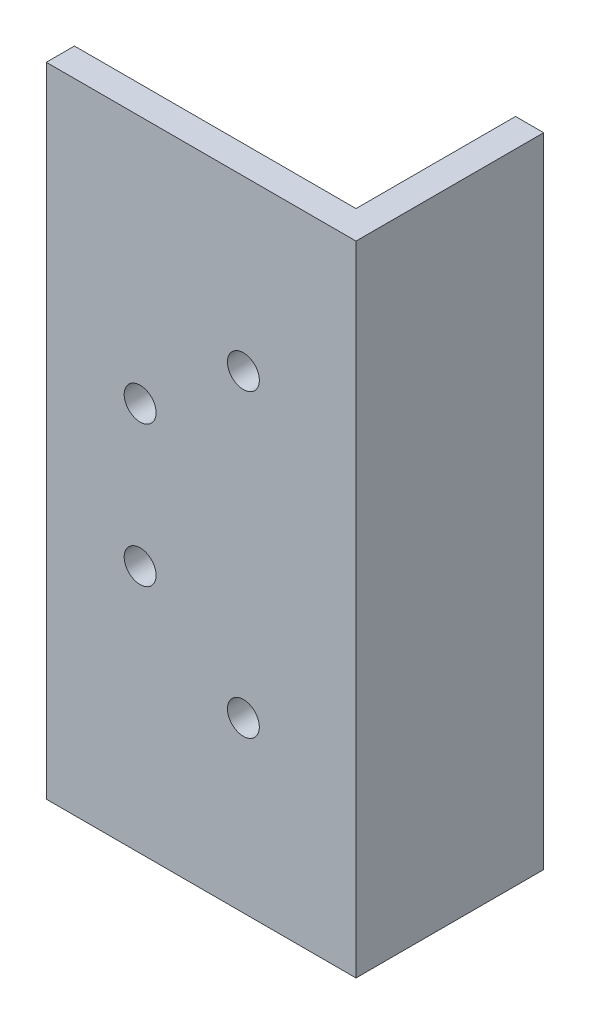
ISO-10303-21;
HEADER;
FILE_DESCRIPTION(('STEP AP214'),'2;1');
FILE_NAME('part.step','',(''),(''),'','','');
FILE_SCHEMA(('AUTOMOTIVE_DESIGN { 1 0 10303 214 1 1 1 1 }'));
ENDSEC;
DATA;
#1=APPLICATION_CONTEXT('core data for automotive mechanical design processes');
#2=APPLICATION_PROTOCOL_DEFINITION('international standard','automotive_design',2000,#1);
#3=PRODUCT_CONTEXT('',#1,'mechanical');
#4=PRODUCT('Part','Part','',(#3));
#5=PRODUCT_RELATED_PRODUCT_CATEGORY('part','',(#4));
#6=PRODUCT_DEFINITION_FORMATION('','',#4);
#7=PRODUCT_DEFINITION_CONTEXT('part definition',#1,'design');
#8=PRODUCT_DEFINITION('design','',#6,#7);
#9=PRODUCT_DEFINITION_SHAPE('','',#8);
#10=(LENGTH_UNIT() NAMED_UNIT(*) SI_UNIT(.MILLI.,.METRE.));
#11=(NAMED_UNIT(*) PLANE_ANGLE_UNIT() SI_UNIT($,.RADIAN.));
#12=(NAMED_UNIT(*) SI_UNIT($,.STERADIAN.) SOLID_ANGLE_UNIT());
#13=UNCERTAINTY_MEASURE_WITH_UNIT(LENGTH_MEASURE(1.E-05),#10,'distance_accuracy_value','');
#14=(GEOMETRIC_REPRESENTATION_CONTEXT(3) GLOBAL_UNCERTAINTY_ASSIGNED_CONTEXT((#13)) GLOBAL_UNIT_ASSIGNED_CONTEXT((#10,
#11,#12)) REPRESENTATION_CONTEXT('',''));
#15=CARTESIAN_POINT('',(0.,0.,0.));
#16=DIRECTION('',(0.,0.,1.));
#17=DIRECTION('',(1.,0.,0.));
#18=AXIS2_PLACEMENT_3D('',#15,#16,#17);
#19=CARTESIAN_POINT('',(0.,68.,0.));
#20=DIRECTION('',(0.,0.,-1.));
#21=DIRECTION('',(-1.,0.,0.));
#22=AXIS2_PLACEMENT_3D('',#19,#20,#21);
#23=PLANE('',#22);
#24=CARTESIAN_POINT('',(10.,41.5,0.));
#25=DIRECTION('',(0.,0.,1.));
#26=DIRECTION('',(1.,0.,0.));
#27=AXIS2_PLACEMENT_3D('',#24,#25,#26);
#28=CIRCLE('',#27,1.7);
#29=CARTESIAN_POINT('',(11.7,41.5,0.));
#30=VERTEX_POINT('',#29);
#31=EDGE_CURVE('E164',#30,#30,#28,.T.);
#32=ORIENTED_EDGE('',*,*,#31,.F.);
#33=EDGE_LOOP('',(#32));
#34=FACE_BOUND('',#33,.T.);
#35=CARTESIAN_POINT('',(10.,26.5,0.));
#36=DIRECTION('',(0.,0.,1.));
#37=DIRECTION('',(1.,0.,0.));
#38=AXIS2_PLACEMENT_3D('',#35,#36,#37);
#39=CIRCLE('',#38,1.7);
#40=CARTESIAN_POINT('',(11.7,26.5,0.));
#41=VERTEX_POINT('',#40);
#42=EDGE_CURVE('E168',#41,#41,#39,.T.);
#43=ORIENTED_EDGE('',*,*,#42,.F.);
#44=EDGE_LOOP('',(#43));
#45=FACE_BOUND('',#44,.T.);
#46=CARTESIAN_POINT('',(21.,50.,0.));
#47=DIRECTION('',(0.,0.,1.));
#48=DIRECTION('',(1.,0.,0.));
#49=AXIS2_PLACEMENT_3D('',#46,#47,#48);
#50=CIRCLE('',#49,1.7);
#51=CARTESIAN_POINT('',(22.7,50.,0.));
#52=VERTEX_POINT('',#51);
#53=EDGE_CURVE('E172',#52,#52,#50,.T.);
#54=ORIENTED_EDGE('',*,*,#53,.F.);
#55=EDGE_LOOP('',(#54));
#56=FACE_BOUND('',#55,.T.);
#57=CARTESIAN_POINT('',(21.,18.,0.));
#58=DIRECTION('',(0.,0.,1.));
#59=DIRECTION('',(1.,0.,0.));
#60=AXIS2_PLACEMENT_3D('',#57,#58,#59);
#61=CIRCLE('',#60,1.7);
#62=CARTESIAN_POINT('',(22.7,18.,0.));
#63=VERTEX_POINT('',#62);
#64=EDGE_CURVE('E125',#63,#63,#61,.T.);
#65=ORIENTED_EDGE('',*,*,#64,.F.);
#66=EDGE_LOOP('',(#65));
#67=FACE_BOUND('',#66,.T.);
#68=DIRECTION('',(1.,0.,0.));
#69=VECTOR('',#68,1.);
#70=CARTESIAN_POINT('',(0.,0.,0.));
#71=LINE('',#70,#69);
#72=CARTESIAN_POINT('',(0.,0.,0.));
#73=VERTEX_POINT('',#72);
#74=CARTESIAN_POINT('',(33.,0.,0.));
#75=VERTEX_POINT('',#74);
#76=EDGE_CURVE('E122',#73,#75,#71,.T.);
#77=ORIENTED_EDGE('',*,*,#76,.T.);
#78=DIRECTION('',(0.,-1.,0.));
#79=VECTOR('',#78,1.);
#80=CARTESIAN_POINT('',(33.,68.,0.));
#81=LINE('',#80,#79);
#82=CARTESIAN_POINT('',(33.,68.,0.));
#83=VERTEX_POINT('',#82);
#84=EDGE_CURVE('E11',#83,#75,#81,.T.);
#85=ORIENTED_EDGE('',*,*,#84,.F.);
#86=DIRECTION('',(1.,0.,0.));
#87=VECTOR('',#86,1.);
#88=CARTESIAN_POINT('',(0.,68.,0.));
#89=LINE('',#88,#87);
#90=CARTESIAN_POINT('',(0.,68.,0.));
#91=VERTEX_POINT('',#90);
#92=EDGE_CURVE('E135',#91,#83,#89,.T.);
#93=ORIENTED_EDGE('',*,*,#92,.F.);
#94=DIRECTION('',(0.,-1.,0.));
#95=VECTOR('',#94,1.);
#96=CARTESIAN_POINT('',(0.,68.,0.));
#97=LINE('',#96,#95);
#98=EDGE_CURVE('E53',#91,#73,#97,.T.);
#99=ORIENTED_EDGE('',*,*,#98,.T.);
#100=EDGE_LOOP('',(#77,#85,#93,#99));
#101=FACE_BOUND('',#100,.T.);
#102=ADVANCED_FACE('F37',(#34,#45,#56,#67,#101),#23,.F.);
#103=CARTESIAN_POINT('',(33.,68.,0.));
#104=DIRECTION('',(-1.,0.,0.));
#105=DIRECTION('',(0.,0.,1.));
#106=AXIS2_PLACEMENT_3D('',#103,#104,#105);
#107=PLANE('',#106);
#108=DIRECTION('',(0.,0.,-1.));
#109=VECTOR('',#108,1.);
#110=CARTESIAN_POINT('',(33.,0.,0.));
#111=LINE('',#110,#109);
#112=CARTESIAN_POINT('',(33.,0.,-20.));
#113=VERTEX_POINT('',#112);
#114=EDGE_CURVE('E124',#75,#113,#111,.T.);
#115=ORIENTED_EDGE('',*,*,#114,.T.);
#116=DIRECTION('',(0.,-1.,0.));
#117=VECTOR('',#116,1.);
#118=CARTESIAN_POINT('',(33.,68.,-20.));
#119=LINE('',#118,#117);
#120=CARTESIAN_POINT('',(33.,68.,-20.));
#121=VERTEX_POINT('',#120);
#122=EDGE_CURVE('E45',#121,#113,#119,.T.);
#123=ORIENTED_EDGE('',*,*,#122,.F.);
#124=DIRECTION('',(0.,0.,-1.));
#125=VECTOR('',#124,1.);
#126=CARTESIAN_POINT('',(33.,68.,0.));
#127=LINE('',#126,#125);
#128=EDGE_CURVE('E85',#83,#121,#127,.T.);
#129=ORIENTED_EDGE('',*,*,#128,.F.);
#130=ORIENTED_EDGE('',*,*,#84,.T.);
#131=EDGE_LOOP('',(#115,#123,#129,#130));
#132=FACE_BOUND('',#131,.T.);
#133=ADVANCED_FACE('F156',(#132),#107,.F.);
#134=CARTESIAN_POINT('',(0.,68.,-20.));
#135=DIRECTION('',(0.,0.,1.));
#136=DIRECTION('',(1.,0.,0.));
#137=AXIS2_PLACEMENT_3D('',#134,#135,#136);
#138=PLANE('',#137);
#139=DIRECTION('',(-1.,0.,0.));
#140=VECTOR('',#139,1.);
#141=CARTESIAN_POINT('',(0.,0.,-20.));
#142=LINE('',#141,#140);
#143=CARTESIAN_POINT('',(30.,0.,-20.));
#144=VERTEX_POINT('',#143);
#145=EDGE_CURVE('E127',#113,#144,#142,.T.);
#146=ORIENTED_EDGE('',*,*,#145,.T.);
#147=DIRECTION('',(0.,-1.,0.));
#148=VECTOR('',#147,1.);
#149=CARTESIAN_POINT('',(30.,68.,-20.));
#150=LINE('',#149,#148);
#151=CARTESIAN_POINT('',(30.,68.,-20.));
#152=VERTEX_POINT('',#151);
#153=EDGE_CURVE('E114',#152,#144,#150,.T.);
#154=ORIENTED_EDGE('',*,*,#153,.F.);
#155=DIRECTION('',(-1.,0.,0.));
#156=VECTOR('',#155,1.);
#157=CARTESIAN_POINT('',(0.,68.,-20.));
#158=LINE('',#157,#156);
#159=EDGE_CURVE('E102',#121,#152,#158,.T.);
#160=ORIENTED_EDGE('',*,*,#159,.F.);
#161=ORIENTED_EDGE('',*,*,#122,.T.);
#162=EDGE_LOOP('',(#146,#154,#160,#161));
#163=FACE_BOUND('',#162,.T.);
#164=ADVANCED_FACE('F141',(#163),#138,.F.);
#165=CARTESIAN_POINT('',(30.,68.,0.));
#166=DIRECTION('',(1.,0.,0.));
#167=DIRECTION('',(0.,0.,-1.));
#168=AXIS2_PLACEMENT_3D('',#165,#166,#167);
#169=PLANE('',#168);
#170=DIRECTION('',(0.,0.,1.));
#171=VECTOR('',#170,1.);
#172=CARTESIAN_POINT('',(30.,0.,0.));
#173=LINE('',#172,#171);
#174=CARTESIAN_POINT('',(30.,0.,-3.));
#175=VERTEX_POINT('',#174);
#176=EDGE_CURVE('E111',#144,#175,#173,.T.);
#177=ORIENTED_EDGE('',*,*,#176,.T.);
#178=DIRECTION('',(0.,-1.,0.));
#179=VECTOR('',#178,1.);
#180=CARTESIAN_POINT('',(30.,68.,-3.));
#181=LINE('',#180,#179);
#182=CARTESIAN_POINT('',(30.,68.,-3.));
#183=VERTEX_POINT('',#182);
#184=EDGE_CURVE('E108',#183,#175,#181,.T.);
#185=ORIENTED_EDGE('',*,*,#184,.F.);
#186=DIRECTION('',(0.,0.,1.));
#187=VECTOR('',#186,1.);
#188=CARTESIAN_POINT('',(30.,68.,0.));
#189=LINE('',#188,#187);
#190=EDGE_CURVE('E95',#152,#183,#189,.T.);
#191=ORIENTED_EDGE('',*,*,#190,.F.);
#192=ORIENTED_EDGE('',*,*,#153,.T.);
#193=EDGE_LOOP('',(#177,#185,#191,#192));
#194=FACE_BOUND('',#193,.T.);
#195=ADVANCED_FACE('F109',(#194),#169,.F.);
#196=CARTESIAN_POINT('',(0.,68.,-3.));
#197=DIRECTION('',(0.,0.,-1.));
#198=DIRECTION('',(-1.,0.,0.));
#199=AXIS2_PLACEMENT_3D('',#196,#197,#198);
#200=PLANE('',#199);
#201=CARTESIAN_POINT('',(10.,41.5,-3.));
#202=DIRECTION('',(0.,0.,-1.));
#203=DIRECTION('',(-1.,0.,0.));
#204=AXIS2_PLACEMENT_3D('',#201,#202,#203);
#205=CIRCLE('',#204,1.7);
#206=CARTESIAN_POINT('',(8.3,41.5,-3.));
#207=VERTEX_POINT('',#206);
#208=EDGE_CURVE('E191',#207,#207,#205,.F.);
#209=ORIENTED_EDGE('',*,*,#208,.T.);
#210=EDGE_LOOP('',(#209));
#211=FACE_BOUND('',#210,.T.);
#212=CARTESIAN_POINT('',(10.,26.5,-3.));
#213=DIRECTION('',(0.,0.,-1.));
#214=DIRECTION('',(-1.,0.,0.));
#215=AXIS2_PLACEMENT_3D('',#212,#213,#214);
#216=CIRCLE('',#215,1.7);
#217=CARTESIAN_POINT('',(8.3,26.5,-3.));
#218=VERTEX_POINT('',#217);
#219=EDGE_CURVE('E187',#218,#218,#216,.F.);
#220=ORIENTED_EDGE('',*,*,#219,.T.);
#221=EDGE_LOOP('',(#220));
#222=FACE_BOUND('',#221,.T.);
#223=CARTESIAN_POINT('',(21.,50.,-3.));
#224=DIRECTION('',(0.,0.,-1.));
#225=DIRECTION('',(-1.,0.,0.));
#226=AXIS2_PLACEMENT_3D('',#223,#224,#225);
#227=CIRCLE('',#226,1.7);
#228=CARTESIAN_POINT('',(19.3,50.,-3.));
#229=VERTEX_POINT('',#228);
#230=EDGE_CURVE('E183',#229,#229,#227,.F.);
#231=ORIENTED_EDGE('',*,*,#230,.T.);
#232=EDGE_LOOP('',(#231));
#233=FACE_BOUND('',#232,.T.);
#234=CARTESIAN_POINT('',(21.,18.,-3.));
#235=DIRECTION('',(0.,0.,-1.));
#236=DIRECTION('',(-1.,0.,0.));
#237=AXIS2_PLACEMENT_3D('',#234,#235,#236);
#238=CIRCLE('',#237,1.7);
#239=CARTESIAN_POINT('',(19.3,18.,-3.));
#240=VERTEX_POINT('',#239);
#241=EDGE_CURVE('E179',#240,#240,#238,.F.);
#242=ORIENTED_EDGE('',*,*,#241,.T.);
#243=EDGE_LOOP('',(#242));
#244=FACE_BOUND('',#243,.T.);
#245=DIRECTION('',(1.,0.,0.));
#246=VECTOR('',#245,1.);
#247=CARTESIAN_POINT('',(0.,0.,-3.));
#248=LINE('',#247,#246);
#249=CARTESIAN_POINT('',(0.,0.,-3.));
#250=VERTEX_POINT('',#249);
#251=EDGE_CURVE('E130',#250,#175,#248,.T.);
#252=ORIENTED_EDGE('',*,*,#251,.F.);
#253=DIRECTION('',(0.,-1.,0.));
#254=VECTOR('',#253,1.);
#255=CARTESIAN_POINT('',(0.,68.,-3.));
#256=LINE('',#255,#254);
#257=CARTESIAN_POINT('',(0.,68.,-3.));
#258=VERTEX_POINT('',#257);
#259=EDGE_CURVE('E73',#258,#250,#256,.T.);
#260=ORIENTED_EDGE('',*,*,#259,.F.);
#261=DIRECTION('',(1.,0.,0.));
#262=VECTOR('',#261,1.);
#263=CARTESIAN_POINT('',(0.,68.,-3.));
#264=LINE('',#263,#262);
#265=EDGE_CURVE('E100',#258,#183,#264,.T.);
#266=ORIENTED_EDGE('',*,*,#265,.T.);
#267=ORIENTED_EDGE('',*,*,#184,.T.);
#268=EDGE_LOOP('',(#252,#260,#266,#267));
#269=FACE_BOUND('',#268,.T.);
#270=ADVANCED_FACE('F116',(#211,#222,#233,#244,#269),#200,.T.);
#271=CARTESIAN_POINT('',(0.,68.,0.));
#272=DIRECTION('',(-1.,0.,0.));
#273=DIRECTION('',(0.,0.,1.));
#274=AXIS2_PLACEMENT_3D('',#271,#272,#273);
#275=PLANE('',#274);
#276=DIRECTION('',(0.,0.,-1.));
#277=VECTOR('',#276,1.);
#278=CARTESIAN_POINT('',(0.,0.,0.));
#279=LINE('',#278,#277);
#280=EDGE_CURVE('E132',#73,#250,#279,.T.);
#281=ORIENTED_EDGE('',*,*,#280,.F.);
#282=ORIENTED_EDGE('',*,*,#98,.F.);
#283=DIRECTION('',(0.,0.,-1.));
#284=VECTOR('',#283,1.);
#285=CARTESIAN_POINT('',(0.,68.,0.));
#286=LINE('',#285,#284);
#287=EDGE_CURVE('E117',#91,#258,#286,.T.);
#288=ORIENTED_EDGE('',*,*,#287,.T.);
#289=ORIENTED_EDGE('',*,*,#259,.T.);
#290=EDGE_LOOP('',(#281,#282,#288,#289));
#291=FACE_BOUND('',#290,.T.);
#292=ADVANCED_FACE('F144',(#291),#275,.T.);
#293=CARTESIAN_POINT('',(0.,68.,0.));
#294=DIRECTION('',(0.,1.,0.));
#295=DIRECTION('',(0.,0.,1.));
#296=AXIS2_PLACEMENT_3D('',#293,#294,#295);
#297=PLANE('',#296);
#298=ORIENTED_EDGE('',*,*,#92,.T.);
#299=ORIENTED_EDGE('',*,*,#128,.T.);
#300=ORIENTED_EDGE('',*,*,#159,.T.);
#301=ORIENTED_EDGE('',*,*,#190,.T.);
#302=ORIENTED_EDGE('',*,*,#265,.F.);
#303=ORIENTED_EDGE('',*,*,#287,.F.);
#304=EDGE_LOOP('',(#298,#299,#300,#301,#302,#303));
#305=FACE_BOUND('',#304,.T.);
#306=ADVANCED_FACE('F97',(#305),#297,.T.);
#307=CARTESIAN_POINT('',(0.,0.,0.));
#308=DIRECTION('',(0.,1.,0.));
#309=DIRECTION('',(0.,0.,1.));
#310=AXIS2_PLACEMENT_3D('',#307,#308,#309);
#311=PLANE('',#310);
#312=ORIENTED_EDGE('',*,*,#76,.F.);
#313=ORIENTED_EDGE('',*,*,#280,.T.);
#314=ORIENTED_EDGE('',*,*,#251,.T.);
#315=ORIENTED_EDGE('',*,*,#176,.F.);
#316=ORIENTED_EDGE('',*,*,#145,.F.);
#317=ORIENTED_EDGE('',*,*,#114,.F.);
#318=EDGE_LOOP('',(#312,#313,#314,#315,#316,#317));
#319=FACE_BOUND('',#318,.T.);
#320=ADVANCED_FACE('F143',(#319),#311,.F.);
#321=CARTESIAN_POINT('',(21.,18.,-20.001));
#322=DIRECTION('',(0.,0.,1.));
#323=DIRECTION('',(1.,0.,0.));
#324=AXIS2_PLACEMENT_3D('',#321,#322,#323);
#325=CYLINDRICAL_SURFACE('',#324,1.7);
#326=ORIENTED_EDGE('',*,*,#241,.F.);
#327=EDGE_LOOP('',(#326));
#328=FACE_BOUND('',#327,.T.);
#329=ORIENTED_EDGE('',*,*,#64,.T.);
#330=EDGE_LOOP('',(#329));
#331=FACE_BOUND('',#330,.T.);
#332=ADVANCED_FACE('F210',(#328,#331),#325,.F.);
#333=CARTESIAN_POINT('',(21.,50.,-20.001));
#334=DIRECTION('',(0.,0.,1.));
#335=DIRECTION('',(1.,0.,0.));
#336=AXIS2_PLACEMENT_3D('',#333,#334,#335);
#337=CYLINDRICAL_SURFACE('',#336,1.7);
#338=ORIENTED_EDGE('',*,*,#230,.F.);
#339=EDGE_LOOP('',(#338));
#340=FACE_BOUND('',#339,.T.);
#341=ORIENTED_EDGE('',*,*,#53,.T.);
#342=EDGE_LOOP('',(#341));
#343=FACE_BOUND('',#342,.T.);
#344=ADVANCED_FACE('F203',(#340,#343),#337,.F.);
#345=CARTESIAN_POINT('',(10.,26.5,-20.001));
#346=DIRECTION('',(0.,0.,1.));
#347=DIRECTION('',(1.,0.,0.));
#348=AXIS2_PLACEMENT_3D('',#345,#346,#347);
#349=CYLINDRICAL_SURFACE('',#348,1.7);
#350=ORIENTED_EDGE('',*,*,#219,.F.);
#351=EDGE_LOOP('',(#350));
#352=FACE_BOUND('',#351,.T.);
#353=ORIENTED_EDGE('',*,*,#42,.T.);
#354=EDGE_LOOP('',(#353));
#355=FACE_BOUND('',#354,.T.);
#356=ADVANCED_FACE('F197',(#352,#355),#349,.F.);
#357=CARTESIAN_POINT('',(10.,41.5,-20.001));
#358=DIRECTION('',(0.,0.,1.));
#359=DIRECTION('',(1.,0.,0.));
#360=AXIS2_PLACEMENT_3D('',#357,#358,#359);
#361=CYLINDRICAL_SURFACE('',#360,1.7);
#362=ORIENTED_EDGE('',*,*,#208,.F.);
#363=EDGE_LOOP('',(#362));
#364=FACE_BOUND('',#363,.T.);
#365=ORIENTED_EDGE('',*,*,#31,.T.);
#366=EDGE_LOOP('',(#365));
#367=FACE_BOUND('',#366,.T.);
#368=ADVANCED_FACE('F195',(#364,#367),#361,.F.);
#369=CLOSED_SHELL('',(#102,#133,#164,#195,#270,#292,#306,#320,#332,#344,#356,#368));
#370=MANIFOLD_SOLID_BREP('B2',#369);
#371=ADVANCED_BREP_SHAPE_REPRESENTATION('',(#18,#370),#14);
#372=SHAPE_DEFINITION_REPRESENTATION(#9,#371);
ENDSEC;
END-ISO-10303-21;
